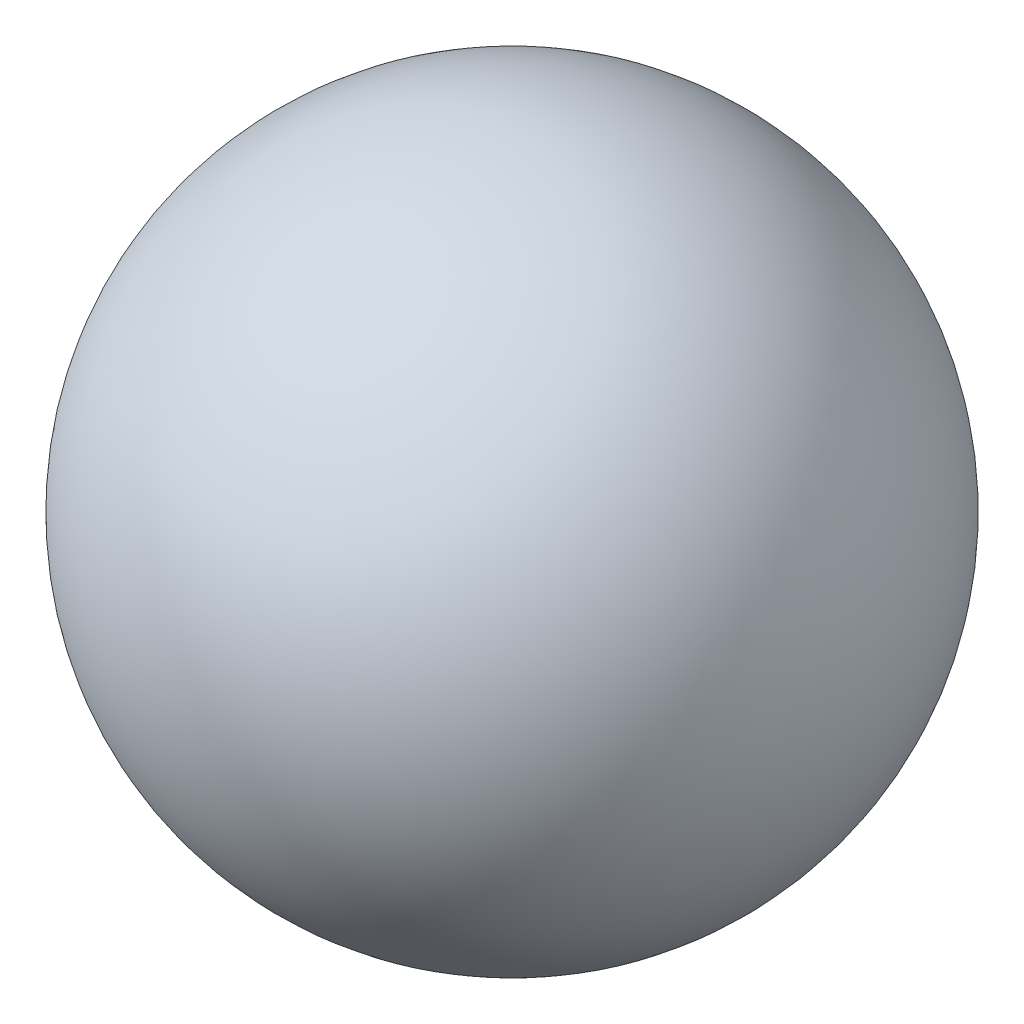
ISO-10303-21;
HEADER;
FILE_DESCRIPTION(('STEP AP214'),'2;1');
FILE_NAME('part.step','',(''),(''),'','','');
FILE_SCHEMA(('AUTOMOTIVE_DESIGN { 1 0 10303 214 1 1 1 1 }'));
ENDSEC;
DATA;
#1=APPLICATION_CONTEXT('core data for automotive mechanical design processes');
#2=APPLICATION_PROTOCOL_DEFINITION('international standard','automotive_design',2000,#1);
#3=PRODUCT_CONTEXT('',#1,'mechanical');
#4=PRODUCT('Part','Part','',(#3));
#5=PRODUCT_RELATED_PRODUCT_CATEGORY('part','',(#4));
#6=PRODUCT_DEFINITION_FORMATION('','',#4);
#7=PRODUCT_DEFINITION_CONTEXT('part definition',#1,'design');
#8=PRODUCT_DEFINITION('design','',#6,#7);
#9=PRODUCT_DEFINITION_SHAPE('','',#8);
#10=(LENGTH_UNIT() NAMED_UNIT(*) SI_UNIT(.MILLI.,.METRE.));
#11=(NAMED_UNIT(*) PLANE_ANGLE_UNIT() SI_UNIT($,.RADIAN.));
#12=(NAMED_UNIT(*) SI_UNIT($,.STERADIAN.) SOLID_ANGLE_UNIT());
#13=UNCERTAINTY_MEASURE_WITH_UNIT(LENGTH_MEASURE(1.E-05),#10,'distance_accuracy_value','');
#14=(GEOMETRIC_REPRESENTATION_CONTEXT(3) GLOBAL_UNCERTAINTY_ASSIGNED_CONTEXT((#13)) GLOBAL_UNIT_ASSIGNED_CONTEXT((#10,
#11,#12)) REPRESENTATION_CONTEXT('',''));
#15=CARTESIAN_POINT('',(0.,0.,0.));
#16=DIRECTION('',(0.,0.,1.));
#17=DIRECTION('',(1.,0.,0.));
#18=AXIS2_PLACEMENT_3D('',#15,#16,#17);
#19=CARTESIAN_POINT('',(0.,107.95,0.));
#20=DIRECTION('',(0.,1.,0.));
#21=DIRECTION('',(1.,0.,0.));
#22=AXIS2_PLACEMENT_3D('',#19,#20,#21);
#23=SPHERICAL_SURFACE('',#22,107.95);
#24=CARTESIAN_POINT('',(0.,215.9,0.));
#25=VERTEX_POINT('',#24);
#26=VERTEX_LOOP('',#25);
#27=FACE_BOUND('',#26,.T.);
#28=ADVANCED_FACE('F30',(#27),#23,.T.);
#29=CLOSED_SHELL('',(#28));
#30=MANIFOLD_SOLID_BREP('B2',#29);
#31=ADVANCED_BREP_SHAPE_REPRESENTATION('',(#18,#30),#14);
#32=SHAPE_DEFINITION_REPRESENTATION(#9,#31);
ENDSEC;
END-ISO-10303-21;
